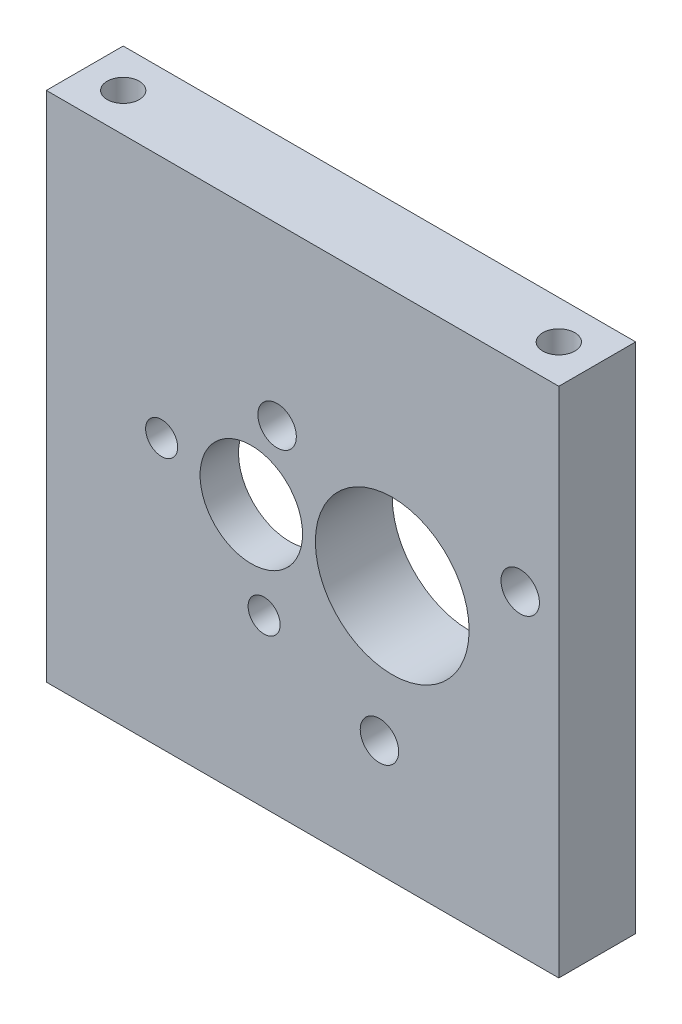
ISO-10303-21;
HEADER;
FILE_DESCRIPTION(('STEP AP214'),'2;1');
FILE_NAME('part.step','',(''),(''),'','','');
FILE_SCHEMA(('AUTOMOTIVE_DESIGN { 1 0 10303 214 1 1 1 1 }'));
ENDSEC;
DATA;
#1=APPLICATION_CONTEXT('core data for automotive mechanical design processes');
#2=APPLICATION_PROTOCOL_DEFINITION('international standard','automotive_design',2000,#1);
#3=PRODUCT_CONTEXT('',#1,'mechanical');
#4=PRODUCT('Part','Part','',(#3));
#5=PRODUCT_RELATED_PRODUCT_CATEGORY('part','',(#4));
#6=PRODUCT_DEFINITION_FORMATION('','',#4);
#7=PRODUCT_DEFINITION_CONTEXT('part definition',#1,'design');
#8=PRODUCT_DEFINITION('design','',#6,#7);
#9=PRODUCT_DEFINITION_SHAPE('','',#8);
#10=(LENGTH_UNIT() NAMED_UNIT(*) SI_UNIT(.MILLI.,.METRE.));
#11=(NAMED_UNIT(*) PLANE_ANGLE_UNIT() SI_UNIT($,.RADIAN.));
#12=(NAMED_UNIT(*) SI_UNIT($,.STERADIAN.) SOLID_ANGLE_UNIT());
#13=UNCERTAINTY_MEASURE_WITH_UNIT(LENGTH_MEASURE(1.E-05),#10,'distance_accuracy_value','');
#14=(GEOMETRIC_REPRESENTATION_CONTEXT(3) GLOBAL_UNCERTAINTY_ASSIGNED_CONTEXT((#13)) GLOBAL_UNIT_ASSIGNED_CONTEXT((#10,
#11,#12)) REPRESENTATION_CONTEXT('',''));
#15=CARTESIAN_POINT('',(0.,0.,0.));
#16=DIRECTION('',(0.,0.,1.));
#17=DIRECTION('',(1.,0.,0.));
#18=AXIS2_PLACEMENT_3D('',#15,#16,#17);
#19=CARTESIAN_POINT('',(-16.,20.,-6.));
#20=DIRECTION('',(-1.,0.,0.));
#21=DIRECTION('',(0.,-1.,0.));
#22=AXIS2_PLACEMENT_3D('',#19,#20,#21);
#23=PLANE('',#22);
#24=DIRECTION('',(0.,-1.,0.));
#25=VECTOR('',#24,1.);
#26=CARTESIAN_POINT('',(-16.,20.,0.));
#27=LINE('',#26,#25);
#28=CARTESIAN_POINT('',(-16.,20.,0.));
#29=VERTEX_POINT('',#28);
#30=CARTESIAN_POINT('',(-16.,-20.,0.));
#31=VERTEX_POINT('',#30);
#32=EDGE_CURVE('E243',#29,#31,#27,.T.);
#33=ORIENTED_EDGE('',*,*,#32,.F.);
#34=DIRECTION('',(0.,0.,1.));
#35=VECTOR('',#34,1.);
#36=CARTESIAN_POINT('',(-16.,20.,-6.));
#37=LINE('',#36,#35);
#38=CARTESIAN_POINT('',(-16.,20.,-6.));
#39=VERTEX_POINT('',#38);
#40=EDGE_CURVE('E11',#39,#29,#37,.T.);
#41=ORIENTED_EDGE('',*,*,#40,.F.);
#42=DIRECTION('',(0.,-1.,0.));
#43=VECTOR('',#42,1.);
#44=CARTESIAN_POINT('',(-16.,20.,-6.));
#45=LINE('',#44,#43);
#46=CARTESIAN_POINT('',(-16.,-20.,-6.));
#47=VERTEX_POINT('',#46);
#48=EDGE_CURVE('E244',#39,#47,#45,.T.);
#49=ORIENTED_EDGE('',*,*,#48,.T.);
#50=DIRECTION('',(0.,0.,1.));
#51=VECTOR('',#50,1.);
#52=CARTESIAN_POINT('',(-16.,-20.,-6.));
#53=LINE('',#52,#51);
#54=EDGE_CURVE('E85',#47,#31,#53,.T.);
#55=ORIENTED_EDGE('',*,*,#54,.T.);
#56=EDGE_LOOP('',(#33,#41,#49,#55));
#57=FACE_BOUND('',#56,.T.);
#58=ADVANCED_FACE('F36',(#57),#23,.T.);
#59=CARTESIAN_POINT('',(-16.,20.,-6.));
#60=DIRECTION('',(0.,1.,0.));
#61=DIRECTION('',(0.,0.,1.));
#62=AXIS2_PLACEMENT_3D('',#59,#60,#61);
#63=PLANE('',#62);
#64=CARTESIAN_POINT('',(21.,20.,-3.));
#65=DIRECTION('',(0.,1.,0.));
#66=DIRECTION('',(-1.,0.,0.));
#67=AXIS2_PLACEMENT_3D('',#64,#65,#66);
#68=CIRCLE('',#67,1.25);
#69=CARTESIAN_POINT('',(19.75,20.,-3.));
#70=VERTEX_POINT('',#69);
#71=EDGE_CURVE('E157',#70,#70,#68,.T.);
#72=ORIENTED_EDGE('',*,*,#71,.F.);
#73=EDGE_LOOP('',(#72));
#74=FACE_BOUND('',#73,.T.);
#75=CARTESIAN_POINT('',(-13.,20.,-3.));
#76=DIRECTION('',(0.,1.,0.));
#77=DIRECTION('',(-1.,0.,0.));
#78=AXIS2_PLACEMENT_3D('',#75,#76,#77);
#79=CIRCLE('',#78,1.25);
#80=CARTESIAN_POINT('',(-14.25,20.,-3.));
#81=VERTEX_POINT('',#80);
#82=EDGE_CURVE('E160',#81,#81,#79,.T.);
#83=ORIENTED_EDGE('',*,*,#82,.F.);
#84=EDGE_LOOP('',(#83));
#85=FACE_BOUND('',#84,.T.);
#86=DIRECTION('',(-1.,0.,0.));
#87=VECTOR('',#86,1.);
#88=CARTESIAN_POINT('',(-16.,20.,0.));
#89=LINE('',#88,#87);
#90=CARTESIAN_POINT('',(24.,20.,0.));
#91=VERTEX_POINT('',#90);
#92=EDGE_CURVE('E247',#91,#29,#89,.T.);
#93=ORIENTED_EDGE('',*,*,#92,.F.);
#94=DIRECTION('',(0.,0.,1.));
#95=VECTOR('',#94,1.);
#96=CARTESIAN_POINT('',(24.,20.,-6.));
#97=LINE('',#96,#95);
#98=CARTESIAN_POINT('',(24.,20.,-6.));
#99=VERTEX_POINT('',#98);
#100=EDGE_CURVE('E44',#99,#91,#97,.T.);
#101=ORIENTED_EDGE('',*,*,#100,.F.);
#102=DIRECTION('',(-1.,0.,0.));
#103=VECTOR('',#102,1.);
#104=CARTESIAN_POINT('',(-16.,20.,-6.));
#105=LINE('',#104,#103);
#106=EDGE_CURVE('E252',#99,#39,#105,.T.);
#107=ORIENTED_EDGE('',*,*,#106,.T.);
#108=ORIENTED_EDGE('',*,*,#40,.T.);
#109=EDGE_LOOP('',(#93,#101,#107,#108));
#110=FACE_BOUND('',#109,.T.);
#111=ADVANCED_FACE('F321',(#74,#85,#110),#63,.T.);
#112=CARTESIAN_POINT('',(24.,20.,-6.));
#113=DIRECTION('',(1.,0.,0.));
#114=DIRECTION('',(0.,1.,0.));
#115=AXIS2_PLACEMENT_3D('',#112,#113,#114);
#116=PLANE('',#115);
#117=DIRECTION('',(0.,1.,0.));
#118=VECTOR('',#117,1.);
#119=CARTESIAN_POINT('',(24.,20.,0.));
#120=LINE('',#119,#118);
#121=CARTESIAN_POINT('',(24.,-20.,0.));
#122=VERTEX_POINT('',#121);
#123=EDGE_CURVE('E259',#122,#91,#120,.T.);
#124=ORIENTED_EDGE('',*,*,#123,.F.);
#125=DIRECTION('',(0.,0.,1.));
#126=VECTOR('',#125,1.);
#127=CARTESIAN_POINT('',(24.,-20.,-6.));
#128=LINE('',#127,#126);
#129=CARTESIAN_POINT('',(24.,-20.,-6.));
#130=VERTEX_POINT('',#129);
#131=EDGE_CURVE('E265',#130,#122,#128,.T.);
#132=ORIENTED_EDGE('',*,*,#131,.F.);
#133=DIRECTION('',(0.,1.,0.));
#134=VECTOR('',#133,1.);
#135=CARTESIAN_POINT('',(24.,20.,-6.));
#136=LINE('',#135,#134);
#137=EDGE_CURVE('E249',#130,#99,#136,.T.);
#138=ORIENTED_EDGE('',*,*,#137,.T.);
#139=ORIENTED_EDGE('',*,*,#100,.T.);
#140=EDGE_LOOP('',(#124,#132,#138,#139));
#141=FACE_BOUND('',#140,.T.);
#142=ADVANCED_FACE('F324',(#141),#116,.T.);
#143=CARTESIAN_POINT('',(-16.,-20.,-6.));
#144=DIRECTION('',(0.,-1.,0.));
#145=DIRECTION('',(0.,0.,-1.));
#146=AXIS2_PLACEMENT_3D('',#143,#144,#145);
#147=PLANE('',#146);
#148=CARTESIAN_POINT('',(21.,-20.,-3.));
#149=DIRECTION('',(0.,-1.,0.));
#150=DIRECTION('',(0.,0.,-1.));
#151=AXIS2_PLACEMENT_3D('',#148,#149,#150);
#152=CIRCLE('',#151,1.25);
#153=CARTESIAN_POINT('',(21.,-20.,-4.25));
#154=VERTEX_POINT('',#153);
#155=EDGE_CURVE('E151',#154,#154,#152,.T.);
#156=ORIENTED_EDGE('',*,*,#155,.F.);
#157=EDGE_LOOP('',(#156));
#158=FACE_BOUND('',#157,.T.);
#159=CARTESIAN_POINT('',(-13.,-20.,-3.));
#160=DIRECTION('',(0.,-1.,0.));
#161=DIRECTION('',(0.,0.,-1.));
#162=AXIS2_PLACEMENT_3D('',#159,#160,#161);
#163=CIRCLE('',#162,1.25);
#164=CARTESIAN_POINT('',(-13.,-20.,-4.25));
#165=VERTEX_POINT('',#164);
#166=EDGE_CURVE('E154',#165,#165,#163,.T.);
#167=ORIENTED_EDGE('',*,*,#166,.F.);
#168=EDGE_LOOP('',(#167));
#169=FACE_BOUND('',#168,.T.);
#170=DIRECTION('',(1.,0.,0.));
#171=VECTOR('',#170,1.);
#172=CARTESIAN_POINT('',(-16.,-20.,0.));
#173=LINE('',#172,#171);
#174=EDGE_CURVE('E256',#31,#122,#173,.T.);
#175=ORIENTED_EDGE('',*,*,#174,.F.);
#176=ORIENTED_EDGE('',*,*,#54,.F.);
#177=DIRECTION('',(1.,0.,0.));
#178=VECTOR('',#177,1.);
#179=CARTESIAN_POINT('',(-16.,-20.,-6.));
#180=LINE('',#179,#178);
#181=EDGE_CURVE('E246',#47,#130,#180,.T.);
#182=ORIENTED_EDGE('',*,*,#181,.T.);
#183=ORIENTED_EDGE('',*,*,#131,.T.);
#184=EDGE_LOOP('',(#175,#176,#182,#183));
#185=FACE_BOUND('',#184,.T.);
#186=ADVANCED_FACE('F309',(#158,#169,#185),#147,.T.);
#187=CARTESIAN_POINT('',(-16.,-20.,-6.));
#188=DIRECTION('',(0.,0.,1.));
#189=DIRECTION('',(1.,0.,0.));
#190=AXIS2_PLACEMENT_3D('',#187,#188,#189);
#191=PLANE('',#190);
#192=CARTESIAN_POINT('',(0.,0.,-6.));
#193=DIRECTION('',(0.,0.,-1.));
#194=DIRECTION('',(-1.,0.,0.));
#195=AXIS2_PLACEMENT_3D('',#192,#193,#194);
#196=CIRCLE('',#195,10.);
#197=CARTESIAN_POINT('',(0.,-10.,-6.));
#198=VERTEX_POINT('',#197);
#199=CARTESIAN_POINT('',(-10.,0.,-6.));
#200=VERTEX_POINT('',#199);
#201=EDGE_CURVE('E194',#198,#200,#196,.T.);
#202=ORIENTED_EDGE('',*,*,#201,.F.);
#203=DIRECTION('',(-1.,0.,0.));
#204=VECTOR('',#203,1.);
#205=CARTESIAN_POINT('',(4.,-10.,-6.));
#206=LINE('',#205,#204);
#207=CARTESIAN_POINT('',(4.,-10.,-6.));
#208=VERTEX_POINT('',#207);
#209=EDGE_CURVE('E52',#208,#198,#206,.T.);
#210=ORIENTED_EDGE('',*,*,#209,.F.);
#211=DIRECTION('',(0.,-1.,0.));
#212=VECTOR('',#211,1.);
#213=CARTESIAN_POINT('',(4.,0.,-6.));
#214=LINE('',#213,#212);
#215=CARTESIAN_POINT('',(4.,0.,-6.));
#216=VERTEX_POINT('',#215);
#217=EDGE_CURVE('E186',#216,#208,#214,.T.);
#218=ORIENTED_EDGE('',*,*,#217,.F.);
#219=CARTESIAN_POINT('',(0.,0.,-6.));
#220=DIRECTION('',(0.,0.,-1.));
#221=DIRECTION('',(-1.,0.,0.));
#222=AXIS2_PLACEMENT_3D('',#219,#220,#221);
#223=CIRCLE('',#222,4.);
#224=CARTESIAN_POINT('',(0.,4.,-6.));
#225=VERTEX_POINT('',#224);
#226=EDGE_CURVE('E203',#225,#216,#223,.T.);
#227=ORIENTED_EDGE('',*,*,#226,.F.);
#228=DIRECTION('',(1.,0.,0.));
#229=VECTOR('',#228,1.);
#230=CARTESIAN_POINT('',(-10.,4.,-6.));
#231=LINE('',#230,#229);
#232=CARTESIAN_POINT('',(-10.,4.,-6.));
#233=VERTEX_POINT('',#232);
#234=EDGE_CURVE('E200',#233,#225,#231,.T.);
#235=ORIENTED_EDGE('',*,*,#234,.F.);
#236=DIRECTION('',(0.,1.,0.));
#237=VECTOR('',#236,1.);
#238=CARTESIAN_POINT('',(-10.,4.,-6.));
#239=LINE('',#238,#237);
#240=EDGE_CURVE('E197',#200,#233,#239,.T.);
#241=ORIENTED_EDGE('',*,*,#240,.F.);
#242=EDGE_LOOP('',(#202,#210,#218,#227,#235,#241));
#243=FACE_BOUND('',#242,.T.);
#244=CARTESIAN_POINT('',(2.01316701949481,6.34325097883602,-6.));
#245=DIRECTION('',(0.,0.,-1.));
#246=DIRECTION('',(0.499999999999992,0.866025403784443,0.));
#247=AXIS2_PLACEMENT_3D('',#244,#245,#246);
#248=CIRCLE('',#247,1.5);
#249=CARTESIAN_POINT('',(2.7631670194948,7.64228908451268,-6.));
#250=VERTEX_POINT('',#249);
#251=EDGE_CURVE('E210',#250,#250,#248,.T.);
#252=ORIENTED_EDGE('',*,*,#251,.F.);
#253=EDGE_LOOP('',(#252));
#254=FACE_BOUND('',#253,.T.);
#255=CARTESIAN_POINT('',(20.9868329805051,4.61120017126727,-6.));
#256=DIRECTION('',(0.,0.,-1.));
#257=DIRECTION('',(0.500000000000004,-0.866025403784436,0.));
#258=AXIS2_PLACEMENT_3D('',#255,#256,#257);
#259=CIRCLE('',#258,1.5);
#260=CARTESIAN_POINT('',(21.7368329805051,3.31216206559061,-6.));
#261=VERTEX_POINT('',#260);
#262=EDGE_CURVE('E225',#261,#261,#259,.T.);
#263=ORIENTED_EDGE('',*,*,#262,.F.);
#264=EDGE_LOOP('',(#263));
#265=FACE_BOUND('',#264,.T.);
#266=CARTESIAN_POINT('',(10.,-10.9544511501033,-6.));
#267=DIRECTION('',(0.,0.,-1.));
#268=DIRECTION('',(-1.,0.,0.));
#269=AXIS2_PLACEMENT_3D('',#266,#267,#268);
#270=CIRCLE('',#269,1.5);
#271=CARTESIAN_POINT('',(8.49999999999999,-10.9544511501033,-6.));
#272=VERTEX_POINT('',#271);
#273=EDGE_CURVE('E231',#272,#272,#270,.T.);
#274=ORIENTED_EDGE('',*,*,#273,.F.);
#275=EDGE_LOOP('',(#274));
#276=FACE_BOUND('',#275,.T.);
#277=CARTESIAN_POINT('',(11.,0.,-6.));
#278=DIRECTION('',(0.,0.,-1.));
#279=DIRECTION('',(-1.,0.,0.));
#280=AXIS2_PLACEMENT_3D('',#277,#278,#279);
#281=CIRCLE('',#280,6.);
#282=CARTESIAN_POINT('',(5.,0.,-6.));
#283=VERTEX_POINT('',#282);
#284=EDGE_CURVE('E237',#283,#283,#281,.T.);
#285=ORIENTED_EDGE('',*,*,#284,.F.);
#286=EDGE_LOOP('',(#285));
#287=FACE_BOUND('',#286,.T.);
#288=ORIENTED_EDGE('',*,*,#48,.F.);
#289=ORIENTED_EDGE('',*,*,#106,.F.);
#290=ORIENTED_EDGE('',*,*,#137,.F.);
#291=ORIENTED_EDGE('',*,*,#181,.F.);
#292=EDGE_LOOP('',(#288,#289,#290,#291));
#293=FACE_BOUND('',#292,.T.);
#294=ADVANCED_FACE('F305',(#243,#254,#265,#276,#287,#293),#191,.F.);
#295=CARTESIAN_POINT('',(-16.,-20.,0.));
#296=DIRECTION('',(0.,0.,1.));
#297=DIRECTION('',(1.,0.,0.));
#298=AXIS2_PLACEMENT_3D('',#295,#296,#297);
#299=PLANE('',#298);
#300=CARTESIAN_POINT('',(-7.,1.,0.));
#301=DIRECTION('',(0.,0.,1.));
#302=DIRECTION('',(1.,0.,0.));
#303=AXIS2_PLACEMENT_3D('',#300,#301,#302);
#304=CIRCLE('',#303,1.25);
#305=CARTESIAN_POINT('',(-5.75,1.,0.));
#306=VERTEX_POINT('',#305);
#307=EDGE_CURVE('E166',#306,#306,#304,.F.);
#308=ORIENTED_EDGE('',*,*,#307,.T.);
#309=EDGE_LOOP('',(#308));
#310=FACE_BOUND('',#309,.T.);
#311=CARTESIAN_POINT('',(0.999999999999996,-7.,0.));
#312=DIRECTION('',(0.,0.,1.));
#313=DIRECTION('',(1.,0.,0.));
#314=AXIS2_PLACEMENT_3D('',#311,#312,#313);
#315=CIRCLE('',#314,1.25);
#316=CARTESIAN_POINT('',(2.25,-7.,0.));
#317=VERTEX_POINT('',#316);
#318=EDGE_CURVE('E172',#317,#317,#315,.F.);
#319=ORIENTED_EDGE('',*,*,#318,.T.);
#320=EDGE_LOOP('',(#319));
#321=FACE_BOUND('',#320,.T.);
#322=CARTESIAN_POINT('',(0.,0.,0.));
#323=DIRECTION('',(0.,0.,1.));
#324=DIRECTION('',(1.,0.,0.));
#325=AXIS2_PLACEMENT_3D('',#322,#323,#324);
#326=CIRCLE('',#325,4.);
#327=CARTESIAN_POINT('',(4.,0.,0.));
#328=VERTEX_POINT('',#327);
#329=EDGE_CURVE('E176',#328,#328,#326,.F.);
#330=ORIENTED_EDGE('',*,*,#329,.T.);
#331=EDGE_LOOP('',(#330));
#332=FACE_BOUND('',#331,.T.);
#333=CARTESIAN_POINT('',(2.01316701949481,6.34325097883602,0.));
#334=DIRECTION('',(0.,0.,1.));
#335=DIRECTION('',(1.,0.,0.));
#336=AXIS2_PLACEMENT_3D('',#333,#334,#335);
#337=CIRCLE('',#336,1.5);
#338=CARTESIAN_POINT('',(3.51316701949481,6.34325097883602,0.));
#339=VERTEX_POINT('',#338);
#340=EDGE_CURVE('E222',#339,#339,#337,.F.);
#341=ORIENTED_EDGE('',*,*,#340,.T.);
#342=EDGE_LOOP('',(#341));
#343=FACE_BOUND('',#342,.T.);
#344=CARTESIAN_POINT('',(20.9868329805051,4.61120017126727,0.));
#345=DIRECTION('',(0.,0.,1.));
#346=DIRECTION('',(1.,0.,0.));
#347=AXIS2_PLACEMENT_3D('',#344,#345,#346);
#348=CIRCLE('',#347,1.5);
#349=CARTESIAN_POINT('',(22.4868329805051,4.61120017126727,0.));
#350=VERTEX_POINT('',#349);
#351=EDGE_CURVE('E228',#350,#350,#348,.F.);
#352=ORIENTED_EDGE('',*,*,#351,.T.);
#353=EDGE_LOOP('',(#352));
#354=FACE_BOUND('',#353,.T.);
#355=CARTESIAN_POINT('',(10.,-10.9544511501033,0.));
#356=DIRECTION('',(0.,0.,1.));
#357=DIRECTION('',(1.,0.,0.));
#358=AXIS2_PLACEMENT_3D('',#355,#356,#357);
#359=CIRCLE('',#358,1.5);
#360=CARTESIAN_POINT('',(11.5,-10.9544511501033,0.));
#361=VERTEX_POINT('',#360);
#362=EDGE_CURVE('E234',#361,#361,#359,.F.);
#363=ORIENTED_EDGE('',*,*,#362,.T.);
#364=EDGE_LOOP('',(#363));
#365=FACE_BOUND('',#364,.T.);
#366=CARTESIAN_POINT('',(11.,0.,0.));
#367=DIRECTION('',(0.,0.,1.));
#368=DIRECTION('',(1.,0.,0.));
#369=AXIS2_PLACEMENT_3D('',#366,#367,#368);
#370=CIRCLE('',#369,6.);
#371=CARTESIAN_POINT('',(17.,0.,0.));
#372=VERTEX_POINT('',#371);
#373=EDGE_CURVE('E240',#372,#372,#370,.F.);
#374=ORIENTED_EDGE('',*,*,#373,.T.);
#375=EDGE_LOOP('',(#374));
#376=FACE_BOUND('',#375,.T.);
#377=ORIENTED_EDGE('',*,*,#32,.T.);
#378=ORIENTED_EDGE('',*,*,#174,.T.);
#379=ORIENTED_EDGE('',*,*,#123,.T.);
#380=ORIENTED_EDGE('',*,*,#92,.T.);
#381=EDGE_LOOP('',(#377,#378,#379,#380));
#382=FACE_BOUND('',#381,.T.);
#383=ADVANCED_FACE('F308',(#310,#321,#332,#343,#354,#365,#376,#382),#299,.T.);
#384=CARTESIAN_POINT('',(11.,0.,16.9705627484771));
#385=DIRECTION('',(0.,0.,-1.));
#386=DIRECTION('',(-1.,0.,0.));
#387=AXIS2_PLACEMENT_3D('',#384,#385,#386);
#388=CYLINDRICAL_SURFACE('',#387,6.);
#389=ORIENTED_EDGE('',*,*,#284,.T.);
#390=EDGE_LOOP('',(#389));
#391=FACE_BOUND('',#390,.T.);
#392=ORIENTED_EDGE('',*,*,#373,.F.);
#393=EDGE_LOOP('',(#392));
#394=FACE_BOUND('',#393,.T.);
#395=ADVANCED_FACE('F402',(#391,#394),#388,.F.);
#396=CARTESIAN_POINT('',(10.,-10.9544511501033,4.2426406871193));
#397=DIRECTION('',(0.,0.,-1.));
#398=DIRECTION('',(-1.,0.,0.));
#399=AXIS2_PLACEMENT_3D('',#396,#397,#398);
#400=CYLINDRICAL_SURFACE('',#399,1.5);
#401=ORIENTED_EDGE('',*,*,#273,.T.);
#402=EDGE_LOOP('',(#401));
#403=FACE_BOUND('',#402,.T.);
#404=ORIENTED_EDGE('',*,*,#362,.F.);
#405=EDGE_LOOP('',(#404));
#406=FACE_BOUND('',#405,.T.);
#407=ADVANCED_FACE('F398',(#403,#406),#400,.F.);
#408=CARTESIAN_POINT('',(20.9868329805051,4.61120017126727,4.2426406871193));
#409=DIRECTION('',(0.,0.,-1.));
#410=DIRECTION('',(-1.,0.,0.));
#411=AXIS2_PLACEMENT_3D('',#408,#409,#410);
#412=CYLINDRICAL_SURFACE('',#411,1.5);
#413=ORIENTED_EDGE('',*,*,#262,.T.);
#414=EDGE_LOOP('',(#413));
#415=FACE_BOUND('',#414,.T.);
#416=ORIENTED_EDGE('',*,*,#351,.F.);
#417=EDGE_LOOP('',(#416));
#418=FACE_BOUND('',#417,.T.);
#419=ADVANCED_FACE('F394',(#415,#418),#412,.F.);
#420=CARTESIAN_POINT('',(2.01316701949481,6.34325097883602,4.2426406871193));
#421=DIRECTION('',(0.,0.,-1.));
#422=DIRECTION('',(-1.,0.,0.));
#423=AXIS2_PLACEMENT_3D('',#420,#421,#422);
#424=CYLINDRICAL_SURFACE('',#423,1.5);
#425=ORIENTED_EDGE('',*,*,#251,.T.);
#426=EDGE_LOOP('',(#425));
#427=FACE_BOUND('',#426,.T.);
#428=ORIENTED_EDGE('',*,*,#340,.F.);
#429=EDGE_LOOP('',(#428));
#430=FACE_BOUND('',#429,.T.);
#431=ADVANCED_FACE('F391',(#427,#430),#424,.F.);
#432=CARTESIAN_POINT('',(4.,-10.,-3.));
#433=DIRECTION('',(0.,-1.,0.));
#434=DIRECTION('',(0.,0.,-1.));
#435=AXIS2_PLACEMENT_3D('',#432,#433,#434);
#436=PLANE('',#435);
#437=ORIENTED_EDGE('',*,*,#209,.T.);
#438=DIRECTION('',(0.,0.,-1.));
#439=VECTOR('',#438,1.);
#440=CARTESIAN_POINT('',(0.,-10.,-3.));
#441=LINE('',#440,#439);
#442=CARTESIAN_POINT('',(0.,-10.,-3.));
#443=VERTEX_POINT('',#442);
#444=EDGE_CURVE('E217',#443,#198,#441,.T.);
#445=ORIENTED_EDGE('',*,*,#444,.F.);
#446=DIRECTION('',(-1.,0.,0.));
#447=VECTOR('',#446,1.);
#448=CARTESIAN_POINT('',(4.,-10.,-3.));
#449=LINE('',#448,#447);
#450=CARTESIAN_POINT('',(4.,-10.,-3.));
#451=VERTEX_POINT('',#450);
#452=EDGE_CURVE('E182',#451,#443,#449,.T.);
#453=ORIENTED_EDGE('',*,*,#452,.F.);
#454=DIRECTION('',(0.,0.,-1.));
#455=VECTOR('',#454,1.);
#456=CARTESIAN_POINT('',(4.,-10.,-3.));
#457=LINE('',#456,#455);
#458=EDGE_CURVE('E208',#451,#208,#457,.T.);
#459=ORIENTED_EDGE('',*,*,#458,.T.);
#460=EDGE_LOOP('',(#437,#445,#453,#459));
#461=FACE_BOUND('',#460,.T.);
#462=ADVANCED_FACE('F297',(#461),#436,.F.);
#463=CARTESIAN_POINT('',(4.,0.,-3.));
#464=DIRECTION('',(1.,0.,0.));
#465=DIRECTION('',(0.,1.,0.));
#466=AXIS2_PLACEMENT_3D('',#463,#464,#465);
#467=PLANE('',#466);
#468=ORIENTED_EDGE('',*,*,#217,.T.);
#469=ORIENTED_EDGE('',*,*,#458,.F.);
#470=DIRECTION('',(0.,-1.,0.));
#471=VECTOR('',#470,1.);
#472=CARTESIAN_POINT('',(4.,0.,-3.));
#473=LINE('',#472,#471);
#474=CARTESIAN_POINT('',(4.,0.,-3.));
#475=VERTEX_POINT('',#474);
#476=EDGE_CURVE('E219',#475,#451,#473,.T.);
#477=ORIENTED_EDGE('',*,*,#476,.F.);
#478=DIRECTION('',(0.,0.,-1.));
#479=VECTOR('',#478,1.);
#480=CARTESIAN_POINT('',(4.,0.,-3.));
#481=LINE('',#480,#479);
#482=EDGE_CURVE('E211',#475,#216,#481,.T.);
#483=ORIENTED_EDGE('',*,*,#482,.T.);
#484=EDGE_LOOP('',(#468,#469,#477,#483));
#485=FACE_BOUND('',#484,.T.);
#486=ADVANCED_FACE('F294',(#485),#467,.F.);
#487=CARTESIAN_POINT('',(0.,0.,-3.));
#488=DIRECTION('',(0.,0.,-1.));
#489=DIRECTION('',(-1.,0.,0.));
#490=AXIS2_PLACEMENT_3D('',#487,#488,#489);
#491=CYLINDRICAL_SURFACE('',#490,4.);
#492=ORIENTED_EDGE('',*,*,#226,.T.);
#493=ORIENTED_EDGE('',*,*,#482,.F.);
#494=CARTESIAN_POINT('',(0.,0.,-3.));
#495=DIRECTION('',(0.,0.,-1.));
#496=DIRECTION('',(-1.,0.,0.));
#497=AXIS2_PLACEMENT_3D('',#494,#495,#496);
#498=CIRCLE('',#497,4.);
#499=CARTESIAN_POINT('',(0.,4.,-3.));
#500=VERTEX_POINT('',#499);
#501=EDGE_CURVE('E175',#475,#500,#498,.T.);
#502=ORIENTED_EDGE('',*,*,#501,.T.);
#503=DIRECTION('',(0.,0.,-1.));
#504=VECTOR('',#503,1.);
#505=CARTESIAN_POINT('',(0.,4.,-3.));
#506=LINE('',#505,#504);
#507=EDGE_CURVE('E214',#500,#225,#506,.T.);
#508=ORIENTED_EDGE('',*,*,#507,.T.);
#509=EDGE_LOOP('',(#492,#493,#502,#508));
#510=FACE_BOUND('',#509,.T.);
#511=ORIENTED_EDGE('',*,*,#329,.F.);
#512=EDGE_LOOP('',(#511));
#513=FACE_BOUND('',#512,.T.);
#514=ADVANCED_FACE('F289',(#510,#513),#491,.F.);
#515=CARTESIAN_POINT('',(-10.,4.,-3.));
#516=DIRECTION('',(0.,1.,0.));
#517=DIRECTION('',(-1.,0.,0.));
#518=AXIS2_PLACEMENT_3D('',#515,#516,#517);
#519=PLANE('',#518);
#520=ORIENTED_EDGE('',*,*,#234,.T.);
#521=ORIENTED_EDGE('',*,*,#507,.F.);
#522=DIRECTION('',(1.,0.,0.));
#523=VECTOR('',#522,1.);
#524=CARTESIAN_POINT('',(-10.,4.,-3.));
#525=LINE('',#524,#523);
#526=CARTESIAN_POINT('',(-10.,4.,-3.));
#527=VERTEX_POINT('',#526);
#528=EDGE_CURVE('E192',#527,#500,#525,.T.);
#529=ORIENTED_EDGE('',*,*,#528,.F.);
#530=DIRECTION('',(0.,0.,-1.));
#531=VECTOR('',#530,1.);
#532=CARTESIAN_POINT('',(-10.,4.,-3.));
#533=LINE('',#532,#531);
#534=EDGE_CURVE('E212',#527,#233,#533,.T.);
#535=ORIENTED_EDGE('',*,*,#534,.T.);
#536=EDGE_LOOP('',(#520,#521,#529,#535));
#537=FACE_BOUND('',#536,.T.);
#538=ADVANCED_FACE('F285',(#537),#519,.F.);
#539=CARTESIAN_POINT('',(-10.,4.,-3.));
#540=DIRECTION('',(-1.,0.,0.));
#541=DIRECTION('',(0.,0.,1.));
#542=AXIS2_PLACEMENT_3D('',#539,#540,#541);
#543=PLANE('',#542);
#544=ORIENTED_EDGE('',*,*,#240,.T.);
#545=ORIENTED_EDGE('',*,*,#534,.F.);
#546=DIRECTION('',(0.,1.,0.));
#547=VECTOR('',#546,1.);
#548=CARTESIAN_POINT('',(-10.,4.,-3.));
#549=LINE('',#548,#547);
#550=CARTESIAN_POINT('',(-10.,0.,-3.));
#551=VERTEX_POINT('',#550);
#552=EDGE_CURVE('E189',#551,#527,#549,.T.);
#553=ORIENTED_EDGE('',*,*,#552,.F.);
#554=DIRECTION('',(0.,0.,-1.));
#555=VECTOR('',#554,1.);
#556=CARTESIAN_POINT('',(-10.,0.,-3.));
#557=LINE('',#556,#555);
#558=EDGE_CURVE('E215',#551,#200,#557,.T.);
#559=ORIENTED_EDGE('',*,*,#558,.T.);
#560=EDGE_LOOP('',(#544,#545,#553,#559));
#561=FACE_BOUND('',#560,.T.);
#562=ADVANCED_FACE('F303',(#561),#543,.F.);
#563=CARTESIAN_POINT('',(0.,0.,-3.));
#564=DIRECTION('',(0.,0.,-1.));
#565=DIRECTION('',(-1.,0.,0.));
#566=AXIS2_PLACEMENT_3D('',#563,#564,#565);
#567=CYLINDRICAL_SURFACE('',#566,10.);
#568=ORIENTED_EDGE('',*,*,#201,.T.);
#569=ORIENTED_EDGE('',*,*,#558,.F.);
#570=CARTESIAN_POINT('',(0.,0.,-3.));
#571=DIRECTION('',(0.,0.,-1.));
#572=DIRECTION('',(-1.,0.,0.));
#573=AXIS2_PLACEMENT_3D('',#570,#571,#572);
#574=CIRCLE('',#573,10.);
#575=EDGE_CURVE('E185',#443,#551,#574,.T.);
#576=ORIENTED_EDGE('',*,*,#575,.F.);
#577=ORIENTED_EDGE('',*,*,#444,.T.);
#578=EDGE_LOOP('',(#568,#569,#576,#577));
#579=FACE_BOUND('',#578,.T.);
#580=ADVANCED_FACE('F300',(#579),#567,.F.);
#581=CARTESIAN_POINT('',(0.,0.,-3.));
#582=DIRECTION('',(0.,0.,-1.));
#583=DIRECTION('',(-1.,0.,0.));
#584=AXIS2_PLACEMENT_3D('',#581,#582,#583);
#585=PLANE('',#584);
#586=CARTESIAN_POINT('',(-7.,1.,-3.));
#587=DIRECTION('',(0.,0.,-1.));
#588=DIRECTION('',(-1.,0.,0.));
#589=AXIS2_PLACEMENT_3D('',#586,#587,#588);
#590=CIRCLE('',#589,1.25);
#591=CARTESIAN_POINT('',(-8.25,1.,-3.));
#592=VERTEX_POINT('',#591);
#593=EDGE_CURVE('E163',#592,#592,#590,.T.);
#594=ORIENTED_EDGE('',*,*,#593,.F.);
#595=EDGE_LOOP('',(#594));
#596=FACE_BOUND('',#595,.T.);
#597=CARTESIAN_POINT('',(0.999999999999996,-7.,-3.));
#598=DIRECTION('',(0.,0.,-1.));
#599=DIRECTION('',(-1.,0.,0.));
#600=AXIS2_PLACEMENT_3D('',#597,#598,#599);
#601=CIRCLE('',#600,1.25);
#602=CARTESIAN_POINT('',(-0.250000000000005,-7.,-3.));
#603=VERTEX_POINT('',#602);
#604=EDGE_CURVE('E169',#603,#603,#601,.T.);
#605=ORIENTED_EDGE('',*,*,#604,.F.);
#606=EDGE_LOOP('',(#605));
#607=FACE_BOUND('',#606,.T.);
#608=ORIENTED_EDGE('',*,*,#501,.F.);
#609=ORIENTED_EDGE('',*,*,#476,.T.);
#610=ORIENTED_EDGE('',*,*,#452,.T.);
#611=ORIENTED_EDGE('',*,*,#575,.T.);
#612=ORIENTED_EDGE('',*,*,#552,.T.);
#613=ORIENTED_EDGE('',*,*,#528,.T.);
#614=EDGE_LOOP('',(#608,#609,#610,#611,#612,#613));
#615=FACE_BOUND('',#614,.T.);
#616=ADVANCED_FACE('F280',(#596,#607,#615),#585,.T.);
#617=CARTESIAN_POINT('',(0.999999999999996,-7.,3.53553390593274));
#618=DIRECTION('',(0.,0.,-1.));
#619=DIRECTION('',(-1.,0.,0.));
#620=AXIS2_PLACEMENT_3D('',#617,#618,#619);
#621=CYLINDRICAL_SURFACE('',#620,1.25);
#622=ORIENTED_EDGE('',*,*,#604,.T.);
#623=EDGE_LOOP('',(#622));
#624=FACE_BOUND('',#623,.T.);
#625=ORIENTED_EDGE('',*,*,#318,.F.);
#626=EDGE_LOOP('',(#625));
#627=FACE_BOUND('',#626,.T.);
#628=ADVANCED_FACE('F371',(#624,#627),#621,.F.);
#629=CARTESIAN_POINT('',(-7.,1.,3.53553390593274));
#630=DIRECTION('',(0.,0.,-1.));
#631=DIRECTION('',(-1.,0.,0.));
#632=AXIS2_PLACEMENT_3D('',#629,#630,#631);
#633=CYLINDRICAL_SURFACE('',#632,1.25);
#634=ORIENTED_EDGE('',*,*,#593,.T.);
#635=EDGE_LOOP('',(#634));
#636=FACE_BOUND('',#635,.T.);
#637=ORIENTED_EDGE('',*,*,#307,.F.);
#638=EDGE_LOOP('',(#637));
#639=FACE_BOUND('',#638,.T.);
#640=ADVANCED_FACE('F368',(#636,#639),#633,.F.);
#641=CARTESIAN_POINT('',(-13.,10.,-3.));
#642=DIRECTION('',(0.,1.,0.));
#643=DIRECTION('',(-1.,0.,0.));
#644=AXIS2_PLACEMENT_3D('',#641,#642,#643);
#645=CYLINDRICAL_SURFACE('',#644,1.25);
#646=CARTESIAN_POINT('',(-13.,10.,-3.));
#647=DIRECTION('',(0.,1.,0.));
#648=DIRECTION('',(0.,0.,1.));
#649=AXIS2_PLACEMENT_3D('',#646,#647,#648);
#650=CIRCLE('',#649,1.25);
#651=CARTESIAN_POINT('',(-13.,10.,-1.75));
#652=VERTEX_POINT('',#651);
#653=EDGE_CURVE('E138',#652,#652,#650,.T.);
#654=ORIENTED_EDGE('',*,*,#653,.F.);
#655=EDGE_LOOP('',(#654));
#656=FACE_BOUND('',#655,.T.);
#657=ORIENTED_EDGE('',*,*,#82,.T.);
#658=EDGE_LOOP('',(#657));
#659=FACE_BOUND('',#658,.T.);
#660=ADVANCED_FACE('F360',(#656,#659),#645,.F.);
#661=CARTESIAN_POINT('',(21.,10.,-3.));
#662=DIRECTION('',(0.,1.,0.));
#663=DIRECTION('',(-1.,0.,0.));
#664=AXIS2_PLACEMENT_3D('',#661,#662,#663);
#665=CYLINDRICAL_SURFACE('',#664,1.25);
#666=CARTESIAN_POINT('',(21.,10.,-3.));
#667=DIRECTION('',(0.,1.,0.));
#668=DIRECTION('',(0.,0.,1.));
#669=AXIS2_PLACEMENT_3D('',#666,#667,#668);
#670=CIRCLE('',#669,1.25);
#671=CARTESIAN_POINT('',(21.,10.,-1.75));
#672=VERTEX_POINT('',#671);
#673=EDGE_CURVE('E140',#672,#672,#670,.T.);
#674=ORIENTED_EDGE('',*,*,#673,.F.);
#675=EDGE_LOOP('',(#674));
#676=FACE_BOUND('',#675,.T.);
#677=ORIENTED_EDGE('',*,*,#71,.T.);
#678=EDGE_LOOP('',(#677));
#679=FACE_BOUND('',#678,.T.);
#680=ADVANCED_FACE('F350',(#676,#679),#665,.F.);
#681=CARTESIAN_POINT('',(-13.,-10.,-3.));
#682=DIRECTION('',(0.,-1.,0.));
#683=DIRECTION('',(0.,0.,-1.));
#684=AXIS2_PLACEMENT_3D('',#681,#682,#683);
#685=CYLINDRICAL_SURFACE('',#684,1.25);
#686=CARTESIAN_POINT('',(-13.,-10.,-3.));
#687=DIRECTION('',(0.,-1.,0.));
#688=DIRECTION('',(0.,0.,-1.));
#689=AXIS2_PLACEMENT_3D('',#686,#687,#688);
#690=CIRCLE('',#689,1.25);
#691=CARTESIAN_POINT('',(-13.,-10.,-4.25));
#692=VERTEX_POINT('',#691);
#693=EDGE_CURVE('E148',#692,#692,#690,.T.);
#694=ORIENTED_EDGE('',*,*,#693,.F.);
#695=EDGE_LOOP('',(#694));
#696=FACE_BOUND('',#695,.T.);
#697=ORIENTED_EDGE('',*,*,#166,.T.);
#698=EDGE_LOOP('',(#697));
#699=FACE_BOUND('',#698,.T.);
#700=ADVANCED_FACE('F347',(#696,#699),#685,.F.);
#701=CARTESIAN_POINT('',(21.,-10.,-3.));
#702=DIRECTION('',(0.,-1.,0.));
#703=DIRECTION('',(0.,0.,-1.));
#704=AXIS2_PLACEMENT_3D('',#701,#702,#703);
#705=CYLINDRICAL_SURFACE('',#704,1.25);
#706=CARTESIAN_POINT('',(21.,-10.,-3.));
#707=DIRECTION('',(0.,-1.,0.));
#708=DIRECTION('',(0.,0.,-1.));
#709=AXIS2_PLACEMENT_3D('',#706,#707,#708);
#710=CIRCLE('',#709,1.25);
#711=CARTESIAN_POINT('',(21.,-10.,-4.25));
#712=VERTEX_POINT('',#711);
#713=EDGE_CURVE('E143',#712,#712,#710,.T.);
#714=ORIENTED_EDGE('',*,*,#713,.F.);
#715=EDGE_LOOP('',(#714));
#716=FACE_BOUND('',#715,.T.);
#717=ORIENTED_EDGE('',*,*,#155,.T.);
#718=EDGE_LOOP('',(#717));
#719=FACE_BOUND('',#718,.T.);
#720=ADVANCED_FACE('F349',(#716,#719),#705,.F.);
#721=CARTESIAN_POINT('',(-13.,-10.,-3.));
#722=DIRECTION('',(0.,-1.,0.));
#723=DIRECTION('',(0.,0.,-1.));
#724=AXIS2_PLACEMENT_3D('',#721,#722,#723);
#725=CONICAL_SURFACE('',#724,1.25,1.02974425867665);
#726=CARTESIAN_POINT('',(-13.,-9.24892422621555,-3.));
#727=VERTEX_POINT('',#726);
#728=VERTEX_LOOP('',#727);
#729=FACE_BOUND('',#728,.T.);
#730=ORIENTED_EDGE('',*,*,#693,.T.);
#731=EDGE_LOOP('',(#730));
#732=FACE_BOUND('',#731,.T.);
#733=ADVANCED_FACE('F357',(#729,#732),#725,.F.);
#734=CARTESIAN_POINT('',(21.,-10.,-3.));
#735=DIRECTION('',(0.,-1.,0.));
#736=DIRECTION('',(0.,0.,-1.));
#737=AXIS2_PLACEMENT_3D('',#734,#735,#736);
#738=CONICAL_SURFACE('',#737,1.25,1.02974425867665);
#739=CARTESIAN_POINT('',(21.,-9.24892422621555,-3.));
#740=VERTEX_POINT('',#739);
#741=VERTEX_LOOP('',#740);
#742=FACE_BOUND('',#741,.T.);
#743=ORIENTED_EDGE('',*,*,#713,.T.);
#744=EDGE_LOOP('',(#743));
#745=FACE_BOUND('',#744,.T.);
#746=ADVANCED_FACE('F530',(#742,#745),#738,.F.);
#747=CARTESIAN_POINT('',(21.,10.,-3.));
#748=DIRECTION('',(0.,1.,0.));
#749=DIRECTION('',(0.,0.,1.));
#750=AXIS2_PLACEMENT_3D('',#747,#748,#749);
#751=CONICAL_SURFACE('',#750,1.25,1.02974425867665);
#752=CARTESIAN_POINT('',(21.,9.24892422621555,-3.));
#753=VERTEX_POINT('',#752);
#754=VERTEX_LOOP('',#753);
#755=FACE_BOUND('',#754,.T.);
#756=ORIENTED_EDGE('',*,*,#673,.T.);
#757=EDGE_LOOP('',(#756));
#758=FACE_BOUND('',#757,.T.);
#759=ADVANCED_FACE('F134',(#755,#758),#751,.F.);
#760=CARTESIAN_POINT('',(-13.,10.,-3.));
#761=DIRECTION('',(0.,1.,0.));
#762=DIRECTION('',(0.,0.,1.));
#763=AXIS2_PLACEMENT_3D('',#760,#761,#762);
#764=CONICAL_SURFACE('',#763,1.25,1.02974425867665);
#765=CARTESIAN_POINT('',(-13.,9.24892422621555,-3.));
#766=VERTEX_POINT('',#765);
#767=VERTEX_LOOP('',#766);
#768=FACE_BOUND('',#767,.T.);
#769=ORIENTED_EDGE('',*,*,#653,.T.);
#770=EDGE_LOOP('',(#769));
#771=FACE_BOUND('',#770,.T.);
#772=ADVANCED_FACE('F131',(#768,#771),#764,.F.);
#773=CLOSED_SHELL('',(#58,#111,#142,#186,#294,#383,#395,#407,#419,#431,#462,#486,#514,#538,#562,
#580,#616,#628,#640,#660,#680,#700,#720,#733,#746,#759,#772));
#774=MANIFOLD_SOLID_BREP('B2',#773);
#775=ADVANCED_BREP_SHAPE_REPRESENTATION('',(#18,#774),#14);
#776=SHAPE_DEFINITION_REPRESENTATION(#9,#775);
ENDSEC;
END-ISO-10303-21;
